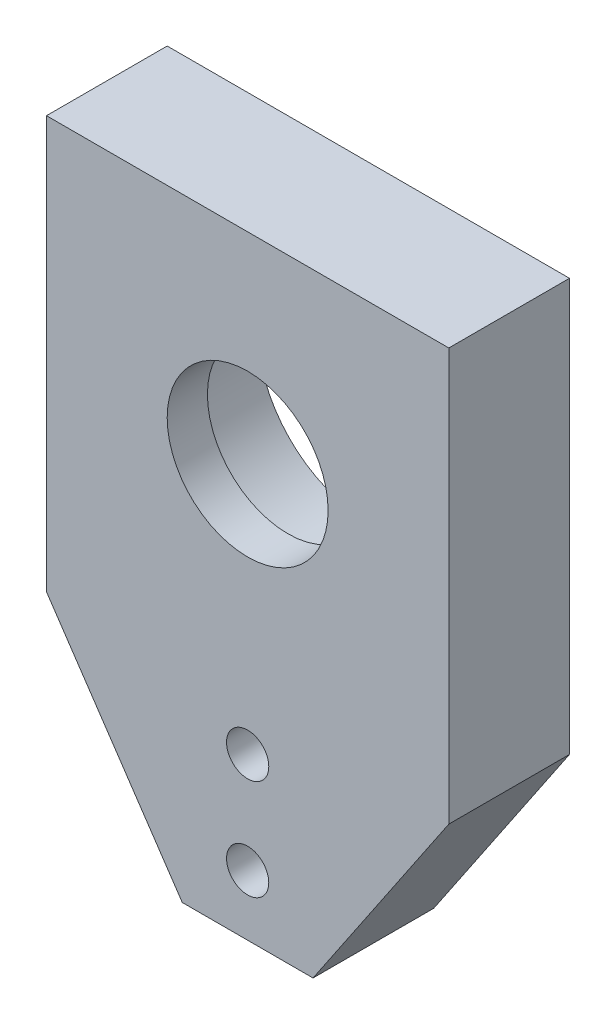
ISO-10303-21;
HEADER;
FILE_DESCRIPTION(('STEP AP214'),'2;1');
FILE_NAME('part.step','',(''),(''),'','','');
FILE_SCHEMA(('AUTOMOTIVE_DESIGN { 1 0 10303 214 1 1 1 1 }'));
ENDSEC;
DATA;
#1=APPLICATION_CONTEXT('core data for automotive mechanical design processes');
#2=APPLICATION_PROTOCOL_DEFINITION('international standard','automotive_design',2000,#1);
#3=PRODUCT_CONTEXT('',#1,'mechanical');
#4=PRODUCT('Part','Part','',(#3));
#5=PRODUCT_RELATED_PRODUCT_CATEGORY('part','',(#4));
#6=PRODUCT_DEFINITION_FORMATION('','',#4);
#7=PRODUCT_DEFINITION_CONTEXT('part definition',#1,'design');
#8=PRODUCT_DEFINITION('design','',#6,#7);
#9=PRODUCT_DEFINITION_SHAPE('','',#8);
#10=(LENGTH_UNIT() NAMED_UNIT(*) SI_UNIT(.MILLI.,.METRE.));
#11=(NAMED_UNIT(*) PLANE_ANGLE_UNIT() SI_UNIT($,.RADIAN.));
#12=(NAMED_UNIT(*) SI_UNIT($,.STERADIAN.) SOLID_ANGLE_UNIT());
#13=UNCERTAINTY_MEASURE_WITH_UNIT(LENGTH_MEASURE(1.E-05),#10,'distance_accuracy_value','');
#14=(GEOMETRIC_REPRESENTATION_CONTEXT(3) GLOBAL_UNCERTAINTY_ASSIGNED_CONTEXT((#13)) GLOBAL_UNIT_ASSIGNED_CONTEXT((#10,
#11,#12)) REPRESENTATION_CONTEXT('',''));
#15=CARTESIAN_POINT('',(0.,0.,0.));
#16=DIRECTION('',(0.,0.,1.));
#17=DIRECTION('',(1.,0.,0.));
#18=AXIS2_PLACEMENT_3D('',#15,#16,#17);
#19=CARTESIAN_POINT('',(0.,0.,0.));
#20=DIRECTION('',(0.,0.,-1.));
#21=DIRECTION('',(-1.,0.,0.));
#22=AXIS2_PLACEMENT_3D('',#19,#20,#21);
#23=PLANE('',#22);
#24=CARTESIAN_POINT('',(0.,-35.,0.));
#25=DIRECTION('',(0.,0.,1.));
#26=DIRECTION('',(1.,0.,0.));
#27=AXIS2_PLACEMENT_3D('',#24,#25,#26);
#28=CIRCLE('',#27,2.1);
#29=CARTESIAN_POINT('',(2.1,-35.,0.));
#30=VERTEX_POINT('',#29);
#31=EDGE_CURVE('E126',#30,#30,#28,.T.);
#32=ORIENTED_EDGE('',*,*,#31,.T.);
#33=EDGE_LOOP('',(#32));
#34=FACE_BOUND('',#33,.T.);
#35=DIRECTION('',(0.,1.,0.));
#36=VECTOR('',#35,1.);
#37=CARTESIAN_POINT('',(20.,20.,0.));
#38=LINE('',#37,#36);
#39=CARTESIAN_POINT('',(20.,-21.,0.));
#40=VERTEX_POINT('',#39);
#41=CARTESIAN_POINT('',(20.,20.,0.));
#42=VERTEX_POINT('',#41);
#43=EDGE_CURVE('E134',#40,#42,#38,.T.);
#44=ORIENTED_EDGE('',*,*,#43,.F.);
#45=DIRECTION('',(0.559472855001063,0.828848674075648,0.));
#46=VECTOR('',#45,1.);
#47=CARTESIAN_POINT('',(20.,-21.,0.));
#48=LINE('',#47,#46);
#49=CARTESIAN_POINT('',(6.5,-41.,0.));
#50=VERTEX_POINT('',#49);
#51=EDGE_CURVE('E48',#50,#40,#48,.T.);
#52=ORIENTED_EDGE('',*,*,#51,.F.);
#53=DIRECTION('',(1.,0.,0.));
#54=VECTOR('',#53,1.);
#55=CARTESIAN_POINT('',(6.5,-41.,0.));
#56=LINE('',#55,#54);
#57=CARTESIAN_POINT('',(-6.5,-41.,0.));
#58=VERTEX_POINT('',#57);
#59=EDGE_CURVE('E56',#58,#50,#56,.T.);
#60=ORIENTED_EDGE('',*,*,#59,.F.);
#61=DIRECTION('',(0.559472855001063,-0.828848674075648,0.));
#62=VECTOR('',#61,1.);
#63=CARTESIAN_POINT('',(-6.5,-41.,0.));
#64=LINE('',#63,#62);
#65=CARTESIAN_POINT('',(-20.,-21.,0.));
#66=VERTEX_POINT('',#65);
#67=EDGE_CURVE('E140',#66,#58,#64,.T.);
#68=ORIENTED_EDGE('',*,*,#67,.F.);
#69=DIRECTION('',(0.,-1.,0.));
#70=VECTOR('',#69,1.);
#71=CARTESIAN_POINT('',(-20.,-21.,0.));
#72=LINE('',#71,#70);
#73=CARTESIAN_POINT('',(-20.,20.,0.));
#74=VERTEX_POINT('',#73);
#75=EDGE_CURVE('E138',#74,#66,#72,.T.);
#76=ORIENTED_EDGE('',*,*,#75,.F.);
#77=DIRECTION('',(-1.,0.,0.));
#78=VECTOR('',#77,1.);
#79=CARTESIAN_POINT('',(-20.,20.,0.));
#80=LINE('',#79,#78);
#81=EDGE_CURVE('E136',#42,#74,#80,.T.);
#82=ORIENTED_EDGE('',*,*,#81,.F.);
#83=EDGE_LOOP('',(#44,#52,#60,#68,#76,#82));
#84=FACE_BOUND('',#83,.T.);
#85=CARTESIAN_POINT('',(0.,0.,0.));
#86=DIRECTION('',(0.,0.,1.));
#87=DIRECTION('',(1.,0.,0.));
#88=AXIS2_PLACEMENT_3D('',#85,#86,#87);
#89=CIRCLE('',#88,11.);
#90=CARTESIAN_POINT('',(11.,0.,0.));
#91=VERTEX_POINT('',#90);
#92=EDGE_CURVE('E129',#91,#91,#89,.T.);
#93=ORIENTED_EDGE('',*,*,#92,.T.);
#94=EDGE_LOOP('',(#93));
#95=FACE_BOUND('',#94,.T.);
#96=CARTESIAN_POINT('',(0.,-25.,0.));
#97=DIRECTION('',(0.,0.,1.));
#98=DIRECTION('',(1.,0.,0.));
#99=AXIS2_PLACEMENT_3D('',#96,#97,#98);
#100=CIRCLE('',#99,2.1);
#101=CARTESIAN_POINT('',(2.1,-25.,0.));
#102=VERTEX_POINT('',#101);
#103=EDGE_CURVE('E123',#102,#102,#100,.T.);
#104=ORIENTED_EDGE('',*,*,#103,.T.);
#105=EDGE_LOOP('',(#104));
#106=FACE_BOUND('',#105,.T.);
#107=ADVANCED_FACE('F33',(#34,#84,#95,#106),#23,.T.);
#108=CARTESIAN_POINT('',(20.,20.,8.));
#109=DIRECTION('',(-1.,0.,0.));
#110=DIRECTION('',(0.,-1.,0.));
#111=AXIS2_PLACEMENT_3D('',#108,#109,#110);
#112=PLANE('',#111);
#113=ORIENTED_EDGE('',*,*,#43,.T.);
#114=DIRECTION('',(0.,0.,-1.));
#115=VECTOR('',#114,1.);
#116=CARTESIAN_POINT('',(20.,20.,8.));
#117=LINE('',#116,#115);
#118=CARTESIAN_POINT('',(20.,20.,12.));
#119=VERTEX_POINT('',#118);
#120=EDGE_CURVE('E11',#119,#42,#117,.T.);
#121=ORIENTED_EDGE('',*,*,#120,.F.);
#122=DIRECTION('',(0.,1.,0.));
#123=VECTOR('',#122,1.);
#124=CARTESIAN_POINT('',(20.,-21.,12.));
#125=LINE('',#124,#123);
#126=CARTESIAN_POINT('',(20.,-21.,12.));
#127=VERTEX_POINT('',#126);
#128=EDGE_CURVE('E96',#127,#119,#125,.T.);
#129=ORIENTED_EDGE('',*,*,#128,.F.);
#130=DIRECTION('',(0.,0.,-1.));
#131=VECTOR('',#130,1.);
#132=CARTESIAN_POINT('',(20.,-21.,8.));
#133=LINE('',#132,#131);
#134=EDGE_CURVE('E85',#127,#40,#133,.T.);
#135=ORIENTED_EDGE('',*,*,#134,.T.);
#136=EDGE_LOOP('',(#113,#121,#129,#135));
#137=FACE_BOUND('',#136,.T.);
#138=ADVANCED_FACE('F35',(#137),#112,.F.);
#139=CARTESIAN_POINT('',(-20.,20.,8.));
#140=DIRECTION('',(0.,-1.,0.));
#141=DIRECTION('',(0.,0.,-1.));
#142=AXIS2_PLACEMENT_3D('',#139,#140,#141);
#143=PLANE('',#142);
#144=ORIENTED_EDGE('',*,*,#81,.T.);
#145=DIRECTION('',(0.,0.,-1.));
#146=VECTOR('',#145,1.);
#147=CARTESIAN_POINT('',(-20.,20.,8.));
#148=LINE('',#147,#146);
#149=CARTESIAN_POINT('',(-20.,20.,12.));
#150=VERTEX_POINT('',#149);
#151=EDGE_CURVE('E41',#150,#74,#148,.T.);
#152=ORIENTED_EDGE('',*,*,#151,.F.);
#153=DIRECTION('',(-1.,0.,0.));
#154=VECTOR('',#153,1.);
#155=CARTESIAN_POINT('',(20.,20.,12.));
#156=LINE('',#155,#154);
#157=EDGE_CURVE('E100',#119,#150,#156,.T.);
#158=ORIENTED_EDGE('',*,*,#157,.F.);
#159=ORIENTED_EDGE('',*,*,#120,.T.);
#160=EDGE_LOOP('',(#144,#152,#158,#159));
#161=FACE_BOUND('',#160,.T.);
#162=ADVANCED_FACE('F178',(#161),#143,.F.);
#163=CARTESIAN_POINT('',(-20.,-21.,8.));
#164=DIRECTION('',(1.,0.,0.));
#165=DIRECTION('',(0.,0.,-1.));
#166=AXIS2_PLACEMENT_3D('',#163,#164,#165);
#167=PLANE('',#166);
#168=ORIENTED_EDGE('',*,*,#75,.T.);
#169=DIRECTION('',(0.,0.,-1.));
#170=VECTOR('',#169,1.);
#171=CARTESIAN_POINT('',(-20.,-21.,8.));
#172=LINE('',#171,#170);
#173=CARTESIAN_POINT('',(-20.,-21.,12.));
#174=VERTEX_POINT('',#173);
#175=EDGE_CURVE('E147',#174,#66,#172,.T.);
#176=ORIENTED_EDGE('',*,*,#175,.F.);
#177=DIRECTION('',(0.,-1.,0.));
#178=VECTOR('',#177,1.);
#179=CARTESIAN_POINT('',(-20.,20.,12.));
#180=LINE('',#179,#178);
#181=EDGE_CURVE('E116',#150,#174,#180,.T.);
#182=ORIENTED_EDGE('',*,*,#181,.F.);
#183=ORIENTED_EDGE('',*,*,#151,.T.);
#184=EDGE_LOOP('',(#168,#176,#182,#183));
#185=FACE_BOUND('',#184,.T.);
#186=ADVANCED_FACE('F153',(#185),#167,.F.);
#187=CARTESIAN_POINT('',(-6.5,-41.,8.));
#188=DIRECTION('',(0.828848674075648,0.559472855001063,0.));
#189=DIRECTION('',(-0.559472855001063,0.828848674075648,0.));
#190=AXIS2_PLACEMENT_3D('',#187,#188,#189);
#191=PLANE('',#190);
#192=ORIENTED_EDGE('',*,*,#67,.T.);
#193=DIRECTION('',(0.,0.,-1.));
#194=VECTOR('',#193,1.);
#195=CARTESIAN_POINT('',(-6.5,-41.,8.));
#196=LINE('',#195,#194);
#197=CARTESIAN_POINT('',(-6.5,-41.,12.));
#198=VERTEX_POINT('',#197);
#199=EDGE_CURVE('E145',#198,#58,#196,.T.);
#200=ORIENTED_EDGE('',*,*,#199,.F.);
#201=DIRECTION('',(0.559472855001063,-0.828848674075648,0.));
#202=VECTOR('',#201,1.);
#203=CARTESIAN_POINT('',(-20.,-21.,12.));
#204=LINE('',#203,#202);
#205=EDGE_CURVE('E119',#174,#198,#204,.T.);
#206=ORIENTED_EDGE('',*,*,#205,.F.);
#207=ORIENTED_EDGE('',*,*,#175,.T.);
#208=EDGE_LOOP('',(#192,#200,#206,#207));
#209=FACE_BOUND('',#208,.T.);
#210=ADVANCED_FACE('F159',(#209),#191,.F.);
#211=CARTESIAN_POINT('',(6.5,-41.,8.));
#212=DIRECTION('',(0.,1.,0.));
#213=DIRECTION('',(0.,0.,1.));
#214=AXIS2_PLACEMENT_3D('',#211,#212,#213);
#215=PLANE('',#214);
#216=ORIENTED_EDGE('',*,*,#59,.T.);
#217=DIRECTION('',(0.,0.,-1.));
#218=VECTOR('',#217,1.);
#219=CARTESIAN_POINT('',(6.5,-41.,8.));
#220=LINE('',#219,#218);
#221=CARTESIAN_POINT('',(6.5,-41.,12.));
#222=VERTEX_POINT('',#221);
#223=EDGE_CURVE('E93',#222,#50,#220,.T.);
#224=ORIENTED_EDGE('',*,*,#223,.F.);
#225=DIRECTION('',(1.,0.,0.));
#226=VECTOR('',#225,1.);
#227=CARTESIAN_POINT('',(-6.5,-41.,12.));
#228=LINE('',#227,#226);
#229=EDGE_CURVE('E107',#198,#222,#228,.T.);
#230=ORIENTED_EDGE('',*,*,#229,.F.);
#231=ORIENTED_EDGE('',*,*,#199,.T.);
#232=EDGE_LOOP('',(#216,#224,#230,#231));
#233=FACE_BOUND('',#232,.T.);
#234=ADVANCED_FACE('F161',(#233),#215,.F.);
#235=CARTESIAN_POINT('',(20.,-21.,8.));
#236=DIRECTION('',(-0.828848674075648,0.559472855001063,0.));
#237=DIRECTION('',(-0.559472855001063,-0.828848674075648,0.));
#238=AXIS2_PLACEMENT_3D('',#235,#236,#237);
#239=PLANE('',#238);
#240=ORIENTED_EDGE('',*,*,#51,.T.);
#241=ORIENTED_EDGE('',*,*,#134,.F.);
#242=DIRECTION('',(0.559472855001063,0.828848674075648,0.));
#243=VECTOR('',#242,1.);
#244=CARTESIAN_POINT('',(6.5,-41.,12.));
#245=LINE('',#244,#243);
#246=EDGE_CURVE('E89',#222,#127,#245,.T.);
#247=ORIENTED_EDGE('',*,*,#246,.F.);
#248=ORIENTED_EDGE('',*,*,#223,.T.);
#249=EDGE_LOOP('',(#240,#241,#247,#248));
#250=FACE_BOUND('',#249,.T.);
#251=ADVANCED_FACE('F87',(#250),#239,.F.);
#252=CARTESIAN_POINT('',(0.,0.,8.));
#253=DIRECTION('',(0.,0.,-1.));
#254=DIRECTION('',(-1.,0.,0.));
#255=AXIS2_PLACEMENT_3D('',#252,#253,#254);
#256=CYLINDRICAL_SURFACE('',#255,11.);
#257=CARTESIAN_POINT('',(0.,0.,8.));
#258=DIRECTION('',(0.,0.,1.));
#259=DIRECTION('',(1.,0.,0.));
#260=AXIS2_PLACEMENT_3D('',#257,#258,#259);
#261=CIRCLE('',#260,11.);
#262=CARTESIAN_POINT('',(11.,0.,8.));
#263=VERTEX_POINT('',#262);
#264=EDGE_CURVE('E122',#263,#263,#261,.T.);
#265=ORIENTED_EDGE('',*,*,#264,.T.);
#266=EDGE_LOOP('',(#265));
#267=FACE_BOUND('',#266,.T.);
#268=ORIENTED_EDGE('',*,*,#92,.F.);
#269=EDGE_LOOP('',(#268));
#270=FACE_BOUND('',#269,.T.);
#271=ADVANCED_FACE('F168',(#267,#270),#256,.F.);
#272=CARTESIAN_POINT('',(0.,-35.,8.));
#273=DIRECTION('',(0.,0.,-1.));
#274=DIRECTION('',(-1.,0.,0.));
#275=AXIS2_PLACEMENT_3D('',#272,#273,#274);
#276=CYLINDRICAL_SURFACE('',#275,2.1);
#277=ORIENTED_EDGE('',*,*,#31,.F.);
#278=EDGE_LOOP('',(#277));
#279=FACE_BOUND('',#278,.T.);
#280=CARTESIAN_POINT('',(0.,-35.,12.));
#281=DIRECTION('',(0.,0.,1.));
#282=DIRECTION('',(1.,0.,0.));
#283=AXIS2_PLACEMENT_3D('',#280,#281,#282);
#284=CIRCLE('',#283,2.1);
#285=CARTESIAN_POINT('',(2.1,-35.,12.));
#286=VERTEX_POINT('',#285);
#287=EDGE_CURVE('E205',#286,#286,#284,.T.);
#288=ORIENTED_EDGE('',*,*,#287,.T.);
#289=EDGE_LOOP('',(#288));
#290=FACE_BOUND('',#289,.T.);
#291=ADVANCED_FACE('F181',(#279,#290),#276,.F.);
#292=CARTESIAN_POINT('',(0.,-25.,8.));
#293=DIRECTION('',(0.,0.,-1.));
#294=DIRECTION('',(-1.,0.,0.));
#295=AXIS2_PLACEMENT_3D('',#292,#293,#294);
#296=CYLINDRICAL_SURFACE('',#295,2.1);
#297=ORIENTED_EDGE('',*,*,#103,.F.);
#298=EDGE_LOOP('',(#297));
#299=FACE_BOUND('',#298,.T.);
#300=CARTESIAN_POINT('',(0.,-25.,12.));
#301=DIRECTION('',(0.,0.,1.));
#302=DIRECTION('',(1.,0.,0.));
#303=AXIS2_PLACEMENT_3D('',#300,#301,#302);
#304=CIRCLE('',#303,2.1);
#305=CARTESIAN_POINT('',(2.1,-25.,12.));
#306=VERTEX_POINT('',#305);
#307=EDGE_CURVE('E207',#306,#306,#304,.T.);
#308=ORIENTED_EDGE('',*,*,#307,.T.);
#309=EDGE_LOOP('',(#308));
#310=FACE_BOUND('',#309,.T.);
#311=ADVANCED_FACE('F185',(#299,#310),#296,.F.);
#312=CARTESIAN_POINT('',(0.,0.,8.));
#313=DIRECTION('',(0.,0.,-1.));
#314=DIRECTION('',(-1.,0.,0.));
#315=AXIS2_PLACEMENT_3D('',#312,#313,#314);
#316=PLANE('',#315);
#317=CARTESIAN_POINT('',(0.,0.,8.));
#318=DIRECTION('',(0.,0.,1.));
#319=DIRECTION('',(1.,0.,0.));
#320=AXIS2_PLACEMENT_3D('',#317,#318,#319);
#321=CIRCLE('',#320,8.);
#322=CARTESIAN_POINT('',(8.,0.,8.));
#323=VERTEX_POINT('',#322);
#324=EDGE_CURVE('E111',#323,#323,#321,.T.);
#325=ORIENTED_EDGE('',*,*,#324,.T.);
#326=EDGE_LOOP('',(#325));
#327=FACE_BOUND('',#326,.T.);
#328=ORIENTED_EDGE('',*,*,#264,.F.);
#329=EDGE_LOOP('',(#328));
#330=FACE_BOUND('',#329,.T.);
#331=ADVANCED_FACE('F189',(#327,#330),#316,.T.);
#332=CARTESIAN_POINT('',(0.,0.,12.));
#333=DIRECTION('',(0.,0.,-1.));
#334=DIRECTION('',(-1.,0.,0.));
#335=AXIS2_PLACEMENT_3D('',#332,#333,#334);
#336=PLANE('',#335);
#337=ORIENTED_EDGE('',*,*,#246,.T.);
#338=ORIENTED_EDGE('',*,*,#128,.T.);
#339=ORIENTED_EDGE('',*,*,#157,.T.);
#340=ORIENTED_EDGE('',*,*,#181,.T.);
#341=ORIENTED_EDGE('',*,*,#205,.T.);
#342=ORIENTED_EDGE('',*,*,#229,.T.);
#343=EDGE_LOOP('',(#337,#338,#339,#340,#341,#342));
#344=FACE_BOUND('',#343,.T.);
#345=CARTESIAN_POINT('',(0.,0.,12.));
#346=DIRECTION('',(0.,0.,1.));
#347=DIRECTION('',(1.,0.,0.));
#348=AXIS2_PLACEMENT_3D('',#345,#346,#347);
#349=CIRCLE('',#348,8.);
#350=CARTESIAN_POINT('',(8.,0.,12.));
#351=VERTEX_POINT('',#350);
#352=EDGE_CURVE('E108',#351,#351,#349,.T.);
#353=ORIENTED_EDGE('',*,*,#352,.F.);
#354=EDGE_LOOP('',(#353));
#355=FACE_BOUND('',#354,.T.);
#356=ORIENTED_EDGE('',*,*,#287,.F.);
#357=EDGE_LOOP('',(#356));
#358=FACE_BOUND('',#357,.T.);
#359=ORIENTED_EDGE('',*,*,#307,.F.);
#360=EDGE_LOOP('',(#359));
#361=FACE_BOUND('',#360,.T.);
#362=ADVANCED_FACE('F103',(#344,#355,#358,#361),#336,.F.);
#363=CARTESIAN_POINT('',(0.,0.,12.));
#364=DIRECTION('',(0.,0.,-1.));
#365=DIRECTION('',(-1.,0.,0.));
#366=AXIS2_PLACEMENT_3D('',#363,#364,#365);
#367=CYLINDRICAL_SURFACE('',#366,8.);
#368=ORIENTED_EDGE('',*,*,#352,.T.);
#369=EDGE_LOOP('',(#368));
#370=FACE_BOUND('',#369,.T.);
#371=ORIENTED_EDGE('',*,*,#324,.F.);
#372=EDGE_LOOP('',(#371));
#373=FACE_BOUND('',#372,.T.);
#374=ADVANCED_FACE('F196',(#370,#373),#367,.F.);
#375=CLOSED_SHELL('',(#107,#138,#162,#186,#210,#234,#251,#271,#291,#311,#331,#362,#374));
#376=MANIFOLD_SOLID_BREP('B2',#375);
#377=ADVANCED_BREP_SHAPE_REPRESENTATION('',(#18,#376),#14);
#378=SHAPE_DEFINITION_REPRESENTATION(#9,#377);
ENDSEC;
END-ISO-10303-21;
